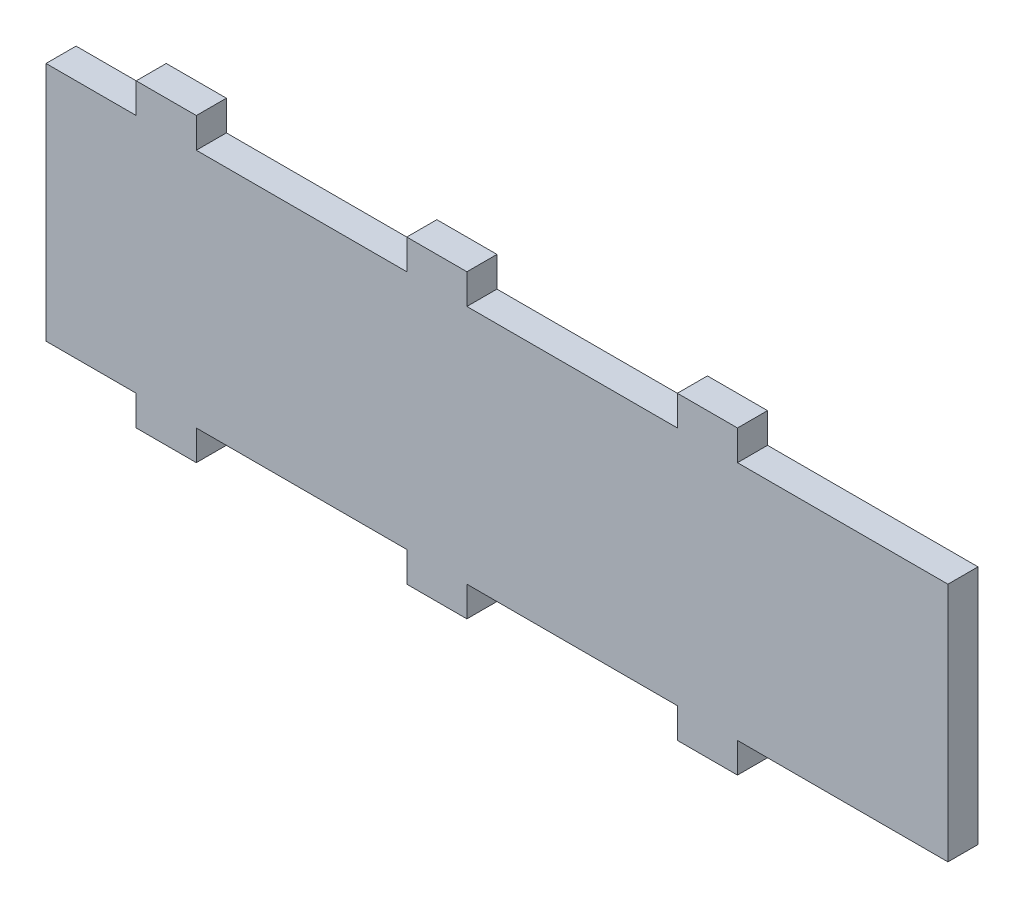
ISO-10303-21;
HEADER;
FILE_DESCRIPTION(('STEP AP214'),'2;1');
FILE_NAME('part.step','',(''),(''),'','','');
FILE_SCHEMA(('AUTOMOTIVE_DESIGN { 1 0 10303 214 1 1 1 1 }'));
ENDSEC;
DATA;
#1=APPLICATION_CONTEXT('core data for automotive mechanical design processes');
#2=APPLICATION_PROTOCOL_DEFINITION('international standard','automotive_design',2000,#1);
#3=PRODUCT_CONTEXT('',#1,'mechanical');
#4=PRODUCT('Part','Part','',(#3));
#5=PRODUCT_RELATED_PRODUCT_CATEGORY('part','',(#4));
#6=PRODUCT_DEFINITION_FORMATION('','',#4);
#7=PRODUCT_DEFINITION_CONTEXT('part definition',#1,'design');
#8=PRODUCT_DEFINITION('design','',#6,#7);
#9=PRODUCT_DEFINITION_SHAPE('','',#8);
#10=(LENGTH_UNIT() NAMED_UNIT(*) SI_UNIT(.MILLI.,.METRE.));
#11=(NAMED_UNIT(*) PLANE_ANGLE_UNIT() SI_UNIT($,.RADIAN.));
#12=(NAMED_UNIT(*) SI_UNIT($,.STERADIAN.) SOLID_ANGLE_UNIT());
#13=UNCERTAINTY_MEASURE_WITH_UNIT(LENGTH_MEASURE(1.E-05),#10,'distance_accuracy_value','');
#14=(GEOMETRIC_REPRESENTATION_CONTEXT(3) GLOBAL_UNCERTAINTY_ASSIGNED_CONTEXT((#13)) GLOBAL_UNIT_ASSIGNED_CONTEXT((#10,
#11,#12)) REPRESENTATION_CONTEXT('',''));
#15=CARTESIAN_POINT('',(0.,0.,0.));
#16=DIRECTION('',(0.,0.,1.));
#17=DIRECTION('',(1.,0.,0.));
#18=AXIS2_PLACEMENT_3D('',#15,#16,#17);
#19=CARTESIAN_POINT('',(0.,0.,5.));
#20=DIRECTION('',(1.,0.,0.));
#21=DIRECTION('',(0.,0.,-1.));
#22=AXIS2_PLACEMENT_3D('',#19,#20,#21);
#23=PLANE('',#22);
#24=DIRECTION('',(0.,-1.,0.));
#25=VECTOR('',#24,1.);
#26=CARTESIAN_POINT('',(0.,0.,0.));
#27=LINE('',#26,#25);
#28=CARTESIAN_POINT('',(0.,40.,0.));
#29=VERTEX_POINT('',#28);
#30=CARTESIAN_POINT('',(0.,0.,0.));
#31=VERTEX_POINT('',#30);
#32=EDGE_CURVE('E249',#29,#31,#27,.T.);
#33=ORIENTED_EDGE('',*,*,#32,.T.);
#34=DIRECTION('',(0.,0.,-1.));
#35=VECTOR('',#34,1.);
#36=CARTESIAN_POINT('',(0.,0.,5.));
#37=LINE('',#36,#35);
#38=CARTESIAN_POINT('',(0.,0.,5.));
#39=VERTEX_POINT('',#38);
#40=EDGE_CURVE('E11',#39,#31,#37,.T.);
#41=ORIENTED_EDGE('',*,*,#40,.F.);
#42=DIRECTION('',(0.,-1.,0.));
#43=VECTOR('',#42,1.);
#44=CARTESIAN_POINT('',(0.,0.,5.));
#45=LINE('',#44,#43);
#46=CARTESIAN_POINT('',(0.,40.,5.));
#47=VERTEX_POINT('',#46);
#48=EDGE_CURVE('E303',#47,#39,#45,.T.);
#49=ORIENTED_EDGE('',*,*,#48,.F.);
#50=DIRECTION('',(0.,0.,-1.));
#51=VECTOR('',#50,1.);
#52=CARTESIAN_POINT('',(0.,40.,5.));
#53=LINE('',#52,#51);
#54=EDGE_CURVE('E245',#47,#29,#53,.T.);
#55=ORIENTED_EDGE('',*,*,#54,.T.);
#56=EDGE_LOOP('',(#33,#41,#49,#55));
#57=FACE_BOUND('',#56,.T.);
#58=ADVANCED_FACE('F33',(#57),#23,.F.);
#59=CARTESIAN_POINT('',(0.,0.,5.));
#60=DIRECTION('',(0.,1.,0.));
#61=DIRECTION('',(0.,0.,1.));
#62=AXIS2_PLACEMENT_3D('',#59,#60,#61);
#63=PLANE('',#62);
#64=DIRECTION('',(1.,0.,0.));
#65=VECTOR('',#64,1.);
#66=CARTESIAN_POINT('',(0.,0.,0.));
#67=LINE('',#66,#65);
#68=CARTESIAN_POINT('',(15.,0.,0.));
#69=VERTEX_POINT('',#68);
#70=EDGE_CURVE('E252',#31,#69,#67,.T.);
#71=ORIENTED_EDGE('',*,*,#70,.T.);
#72=DIRECTION('',(0.,0.,-1.));
#73=VECTOR('',#72,1.);
#74=CARTESIAN_POINT('',(15.,0.,5.));
#75=LINE('',#74,#73);
#76=CARTESIAN_POINT('',(15.,0.,5.));
#77=VERTEX_POINT('',#76);
#78=EDGE_CURVE('E41',#77,#69,#75,.T.);
#79=ORIENTED_EDGE('',*,*,#78,.F.);
#80=DIRECTION('',(1.,0.,0.));
#81=VECTOR('',#80,1.);
#82=CARTESIAN_POINT('',(0.,0.,5.));
#83=LINE('',#82,#81);
#84=EDGE_CURVE('E152',#39,#77,#83,.T.);
#85=ORIENTED_EDGE('',*,*,#84,.F.);
#86=ORIENTED_EDGE('',*,*,#40,.T.);
#87=EDGE_LOOP('',(#71,#79,#85,#86));
#88=FACE_BOUND('',#87,.T.);
#89=ADVANCED_FACE('F461',(#88),#63,.F.);
#90=CARTESIAN_POINT('',(15.,0.,5.));
#91=DIRECTION('',(1.,0.,0.));
#92=DIRECTION('',(0.,0.,-1.));
#93=AXIS2_PLACEMENT_3D('',#90,#91,#92);
#94=PLANE('',#93);
#95=DIRECTION('',(0.,-1.,0.));
#96=VECTOR('',#95,1.);
#97=CARTESIAN_POINT('',(15.,0.,0.));
#98=LINE('',#97,#96);
#99=CARTESIAN_POINT('',(15.,-5.,0.));
#100=VERTEX_POINT('',#99);
#101=EDGE_CURVE('E254',#69,#100,#98,.T.);
#102=ORIENTED_EDGE('',*,*,#101,.T.);
#103=DIRECTION('',(0.,0.,-1.));
#104=VECTOR('',#103,1.);
#105=CARTESIAN_POINT('',(15.,-5.,5.));
#106=LINE('',#105,#104);
#107=CARTESIAN_POINT('',(15.,-5.,5.));
#108=VERTEX_POINT('',#107);
#109=EDGE_CURVE('E370',#108,#100,#106,.T.);
#110=ORIENTED_EDGE('',*,*,#109,.F.);
#111=DIRECTION('',(0.,-1.,0.));
#112=VECTOR('',#111,1.);
#113=CARTESIAN_POINT('',(15.,0.,5.));
#114=LINE('',#113,#112);
#115=EDGE_CURVE('E378',#77,#108,#114,.T.);
#116=ORIENTED_EDGE('',*,*,#115,.F.);
#117=ORIENTED_EDGE('',*,*,#78,.T.);
#118=EDGE_LOOP('',(#102,#110,#116,#117));
#119=FACE_BOUND('',#118,.T.);
#120=ADVANCED_FACE('F376',(#119),#94,.F.);
#121=CARTESIAN_POINT('',(15.,-5.,5.));
#122=DIRECTION('',(0.,1.,0.));
#123=DIRECTION('',(0.,0.,1.));
#124=AXIS2_PLACEMENT_3D('',#121,#122,#123);
#125=PLANE('',#124);
#126=DIRECTION('',(1.,0.,0.));
#127=VECTOR('',#126,1.);
#128=CARTESIAN_POINT('',(15.,-5.,0.));
#129=LINE('',#128,#127);
#130=CARTESIAN_POINT('',(25.,-5.,0.));
#131=VERTEX_POINT('',#130);
#132=EDGE_CURVE('E256',#100,#131,#129,.T.);
#133=ORIENTED_EDGE('',*,*,#132,.T.);
#134=DIRECTION('',(0.,0.,-1.));
#135=VECTOR('',#134,1.);
#136=CARTESIAN_POINT('',(25.,-5.,5.));
#137=LINE('',#136,#135);
#138=CARTESIAN_POINT('',(25.,-5.,5.));
#139=VERTEX_POINT('',#138);
#140=EDGE_CURVE('E367',#139,#131,#137,.T.);
#141=ORIENTED_EDGE('',*,*,#140,.F.);
#142=DIRECTION('',(1.,0.,0.));
#143=VECTOR('',#142,1.);
#144=CARTESIAN_POINT('',(15.,-5.,5.));
#145=LINE('',#144,#143);
#146=EDGE_CURVE('E396',#108,#139,#145,.T.);
#147=ORIENTED_EDGE('',*,*,#146,.F.);
#148=ORIENTED_EDGE('',*,*,#109,.T.);
#149=EDGE_LOOP('',(#133,#141,#147,#148));
#150=FACE_BOUND('',#149,.T.);
#151=ADVANCED_FACE('F387',(#150),#125,.F.);
#152=CARTESIAN_POINT('',(25.,0.,5.));
#153=DIRECTION('',(-1.,0.,0.));
#154=DIRECTION('',(0.,0.,1.));
#155=AXIS2_PLACEMENT_3D('',#152,#153,#154);
#156=PLANE('',#155);
#157=DIRECTION('',(0.,1.,0.));
#158=VECTOR('',#157,1.);
#159=CARTESIAN_POINT('',(25.,0.,0.));
#160=LINE('',#159,#158);
#161=CARTESIAN_POINT('',(25.,0.,0.));
#162=VERTEX_POINT('',#161);
#163=EDGE_CURVE('E258',#131,#162,#160,.T.);
#164=ORIENTED_EDGE('',*,*,#163,.T.);
#165=DIRECTION('',(0.,0.,-1.));
#166=VECTOR('',#165,1.);
#167=CARTESIAN_POINT('',(25.,0.,5.));
#168=LINE('',#167,#166);
#169=CARTESIAN_POINT('',(25.,0.,5.));
#170=VERTEX_POINT('',#169);
#171=EDGE_CURVE('E364',#170,#162,#168,.T.);
#172=ORIENTED_EDGE('',*,*,#171,.F.);
#173=DIRECTION('',(0.,1.,0.));
#174=VECTOR('',#173,1.);
#175=CARTESIAN_POINT('',(25.,0.,5.));
#176=LINE('',#175,#174);
#177=EDGE_CURVE('E393',#139,#170,#176,.T.);
#178=ORIENTED_EDGE('',*,*,#177,.F.);
#179=ORIENTED_EDGE('',*,*,#140,.T.);
#180=EDGE_LOOP('',(#164,#172,#178,#179));
#181=FACE_BOUND('',#180,.T.);
#182=ADVANCED_FACE('F391',(#181),#156,.F.);
#183=CARTESIAN_POINT('',(25.,0.,5.));
#184=DIRECTION('',(0.,1.,0.));
#185=DIRECTION('',(0.,0.,1.));
#186=AXIS2_PLACEMENT_3D('',#183,#184,#185);
#187=PLANE('',#186);
#188=DIRECTION('',(1.,0.,0.));
#189=VECTOR('',#188,1.);
#190=CARTESIAN_POINT('',(25.,0.,0.));
#191=LINE('',#190,#189);
#192=CARTESIAN_POINT('',(60.,0.,0.));
#193=VERTEX_POINT('',#192);
#194=EDGE_CURVE('E260',#162,#193,#191,.T.);
#195=ORIENTED_EDGE('',*,*,#194,.T.);
#196=DIRECTION('',(0.,0.,-1.));
#197=VECTOR('',#196,1.);
#198=CARTESIAN_POINT('',(60.,0.,5.));
#199=LINE('',#198,#197);
#200=CARTESIAN_POINT('',(60.,0.,5.));
#201=VERTEX_POINT('',#200);
#202=EDGE_CURVE('E361',#201,#193,#199,.T.);
#203=ORIENTED_EDGE('',*,*,#202,.F.);
#204=DIRECTION('',(1.,0.,0.));
#205=VECTOR('',#204,1.);
#206=CARTESIAN_POINT('',(25.,0.,5.));
#207=LINE('',#206,#205);
#208=EDGE_CURVE('E395',#170,#201,#207,.T.);
#209=ORIENTED_EDGE('',*,*,#208,.F.);
#210=ORIENTED_EDGE('',*,*,#171,.T.);
#211=EDGE_LOOP('',(#195,#203,#209,#210));
#212=FACE_BOUND('',#211,.T.);
#213=ADVANCED_FACE('F474',(#212),#187,.F.);
#214=CARTESIAN_POINT('',(60.,0.,5.));
#215=DIRECTION('',(1.,0.,0.));
#216=DIRECTION('',(0.,0.,-1.));
#217=AXIS2_PLACEMENT_3D('',#214,#215,#216);
#218=PLANE('',#217);
#219=DIRECTION('',(0.,-1.,0.));
#220=VECTOR('',#219,1.);
#221=CARTESIAN_POINT('',(60.,0.,0.));
#222=LINE('',#221,#220);
#223=CARTESIAN_POINT('',(60.,-5.,0.));
#224=VERTEX_POINT('',#223);
#225=EDGE_CURVE('E262',#193,#224,#222,.T.);
#226=ORIENTED_EDGE('',*,*,#225,.T.);
#227=DIRECTION('',(0.,0.,-1.));
#228=VECTOR('',#227,1.);
#229=CARTESIAN_POINT('',(60.,-5.,5.));
#230=LINE('',#229,#228);
#231=CARTESIAN_POINT('',(60.,-5.,5.));
#232=VERTEX_POINT('',#231);
#233=EDGE_CURVE('E358',#232,#224,#230,.T.);
#234=ORIENTED_EDGE('',*,*,#233,.F.);
#235=DIRECTION('',(0.,-1.,0.));
#236=VECTOR('',#235,1.);
#237=CARTESIAN_POINT('',(60.,0.,5.));
#238=LINE('',#237,#236);
#239=EDGE_CURVE('E398',#201,#232,#238,.T.);
#240=ORIENTED_EDGE('',*,*,#239,.F.);
#241=ORIENTED_EDGE('',*,*,#202,.T.);
#242=EDGE_LOOP('',(#226,#234,#240,#241));
#243=FACE_BOUND('',#242,.T.);
#244=ADVANCED_FACE('F477',(#243),#218,.F.);
#245=CARTESIAN_POINT('',(60.,-5.,5.));
#246=DIRECTION('',(0.,1.,0.));
#247=DIRECTION('',(0.,0.,1.));
#248=AXIS2_PLACEMENT_3D('',#245,#246,#247);
#249=PLANE('',#248);
#250=DIRECTION('',(1.,0.,0.));
#251=VECTOR('',#250,1.);
#252=CARTESIAN_POINT('',(60.,-5.,0.));
#253=LINE('',#252,#251);
#254=CARTESIAN_POINT('',(70.,-5.,0.));
#255=VERTEX_POINT('',#254);
#256=EDGE_CURVE('E264',#224,#255,#253,.T.);
#257=ORIENTED_EDGE('',*,*,#256,.T.);
#258=DIRECTION('',(0.,0.,-1.));
#259=VECTOR('',#258,1.);
#260=CARTESIAN_POINT('',(70.,-5.,5.));
#261=LINE('',#260,#259);
#262=CARTESIAN_POINT('',(70.,-5.,5.));
#263=VERTEX_POINT('',#262);
#264=EDGE_CURVE('E355',#263,#255,#261,.T.);
#265=ORIENTED_EDGE('',*,*,#264,.F.);
#266=DIRECTION('',(1.,0.,0.));
#267=VECTOR('',#266,1.);
#268=CARTESIAN_POINT('',(60.,-5.,5.));
#269=LINE('',#268,#267);
#270=EDGE_CURVE('E404',#232,#263,#269,.T.);
#271=ORIENTED_EDGE('',*,*,#270,.F.);
#272=ORIENTED_EDGE('',*,*,#233,.T.);
#273=EDGE_LOOP('',(#257,#265,#271,#272));
#274=FACE_BOUND('',#273,.T.);
#275=ADVANCED_FACE('F481',(#274),#249,.F.);
#276=CARTESIAN_POINT('',(70.,0.,5.));
#277=DIRECTION('',(-1.,0.,0.));
#278=DIRECTION('',(0.,0.,1.));
#279=AXIS2_PLACEMENT_3D('',#276,#277,#278);
#280=PLANE('',#279);
#281=DIRECTION('',(0.,1.,0.));
#282=VECTOR('',#281,1.);
#283=CARTESIAN_POINT('',(70.,0.,0.));
#284=LINE('',#283,#282);
#285=CARTESIAN_POINT('',(70.,0.,0.));
#286=VERTEX_POINT('',#285);
#287=EDGE_CURVE('E266',#255,#286,#284,.T.);
#288=ORIENTED_EDGE('',*,*,#287,.T.);
#289=DIRECTION('',(0.,0.,-1.));
#290=VECTOR('',#289,1.);
#291=CARTESIAN_POINT('',(70.,0.,5.));
#292=LINE('',#291,#290);
#293=CARTESIAN_POINT('',(70.,0.,5.));
#294=VERTEX_POINT('',#293);
#295=EDGE_CURVE('E352',#294,#286,#292,.T.);
#296=ORIENTED_EDGE('',*,*,#295,.F.);
#297=DIRECTION('',(0.,1.,0.));
#298=VECTOR('',#297,1.);
#299=CARTESIAN_POINT('',(70.,0.,5.));
#300=LINE('',#299,#298);
#301=EDGE_CURVE('E406',#263,#294,#300,.T.);
#302=ORIENTED_EDGE('',*,*,#301,.F.);
#303=ORIENTED_EDGE('',*,*,#264,.T.);
#304=EDGE_LOOP('',(#288,#296,#302,#303));
#305=FACE_BOUND('',#304,.T.);
#306=ADVANCED_FACE('F485',(#305),#280,.F.);
#307=CARTESIAN_POINT('',(70.,0.,5.));
#308=DIRECTION('',(0.,1.,0.));
#309=DIRECTION('',(0.,0.,1.));
#310=AXIS2_PLACEMENT_3D('',#307,#308,#309);
#311=PLANE('',#310);
#312=DIRECTION('',(1.,0.,0.));
#313=VECTOR('',#312,1.);
#314=CARTESIAN_POINT('',(70.,0.,0.));
#315=LINE('',#314,#313);
#316=CARTESIAN_POINT('',(105.,0.,0.));
#317=VERTEX_POINT('',#316);
#318=EDGE_CURVE('E268',#286,#317,#315,.T.);
#319=ORIENTED_EDGE('',*,*,#318,.T.);
#320=DIRECTION('',(0.,0.,-1.));
#321=VECTOR('',#320,1.);
#322=CARTESIAN_POINT('',(105.,0.,5.));
#323=LINE('',#322,#321);
#324=CARTESIAN_POINT('',(105.,0.,5.));
#325=VERTEX_POINT('',#324);
#326=EDGE_CURVE('E349',#325,#317,#323,.T.);
#327=ORIENTED_EDGE('',*,*,#326,.F.);
#328=DIRECTION('',(1.,0.,0.));
#329=VECTOR('',#328,1.);
#330=CARTESIAN_POINT('',(70.,0.,5.));
#331=LINE('',#330,#329);
#332=EDGE_CURVE('E408',#294,#325,#331,.T.);
#333=ORIENTED_EDGE('',*,*,#332,.F.);
#334=ORIENTED_EDGE('',*,*,#295,.T.);
#335=EDGE_LOOP('',(#319,#327,#333,#334));
#336=FACE_BOUND('',#335,.T.);
#337=ADVANCED_FACE('F489',(#336),#311,.F.);
#338=CARTESIAN_POINT('',(105.,0.,5.));
#339=DIRECTION('',(1.,0.,0.));
#340=DIRECTION('',(0.,0.,-1.));
#341=AXIS2_PLACEMENT_3D('',#338,#339,#340);
#342=PLANE('',#341);
#343=DIRECTION('',(0.,-1.,0.));
#344=VECTOR('',#343,1.);
#345=CARTESIAN_POINT('',(105.,0.,0.));
#346=LINE('',#345,#344);
#347=CARTESIAN_POINT('',(105.,-5.,0.));
#348=VERTEX_POINT('',#347);
#349=EDGE_CURVE('E270',#317,#348,#346,.T.);
#350=ORIENTED_EDGE('',*,*,#349,.T.);
#351=DIRECTION('',(0.,0.,-1.));
#352=VECTOR('',#351,1.);
#353=CARTESIAN_POINT('',(105.,-5.,5.));
#354=LINE('',#353,#352);
#355=CARTESIAN_POINT('',(105.,-5.,5.));
#356=VERTEX_POINT('',#355);
#357=EDGE_CURVE('E346',#356,#348,#354,.T.);
#358=ORIENTED_EDGE('',*,*,#357,.F.);
#359=DIRECTION('',(0.,-1.,0.));
#360=VECTOR('',#359,1.);
#361=CARTESIAN_POINT('',(105.,0.,5.));
#362=LINE('',#361,#360);
#363=EDGE_CURVE('E410',#325,#356,#362,.T.);
#364=ORIENTED_EDGE('',*,*,#363,.F.);
#365=ORIENTED_EDGE('',*,*,#326,.T.);
#366=EDGE_LOOP('',(#350,#358,#364,#365));
#367=FACE_BOUND('',#366,.T.);
#368=ADVANCED_FACE('F493',(#367),#342,.F.);
#369=CARTESIAN_POINT('',(105.,-5.,5.));
#370=DIRECTION('',(0.,1.,0.));
#371=DIRECTION('',(0.,0.,1.));
#372=AXIS2_PLACEMENT_3D('',#369,#370,#371);
#373=PLANE('',#372);
#374=DIRECTION('',(1.,0.,0.));
#375=VECTOR('',#374,1.);
#376=CARTESIAN_POINT('',(105.,-5.,0.));
#377=LINE('',#376,#375);
#378=CARTESIAN_POINT('',(115.,-5.,0.));
#379=VERTEX_POINT('',#378);
#380=EDGE_CURVE('E272',#348,#379,#377,.T.);
#381=ORIENTED_EDGE('',*,*,#380,.T.);
#382=DIRECTION('',(0.,0.,-1.));
#383=VECTOR('',#382,1.);
#384=CARTESIAN_POINT('',(115.,-5.,5.));
#385=LINE('',#384,#383);
#386=CARTESIAN_POINT('',(115.,-5.,5.));
#387=VERTEX_POINT('',#386);
#388=EDGE_CURVE('E343',#387,#379,#385,.T.);
#389=ORIENTED_EDGE('',*,*,#388,.F.);
#390=DIRECTION('',(1.,0.,0.));
#391=VECTOR('',#390,1.);
#392=CARTESIAN_POINT('',(105.,-5.,5.));
#393=LINE('',#392,#391);
#394=EDGE_CURVE('E412',#356,#387,#393,.T.);
#395=ORIENTED_EDGE('',*,*,#394,.F.);
#396=ORIENTED_EDGE('',*,*,#357,.T.);
#397=EDGE_LOOP('',(#381,#389,#395,#396));
#398=FACE_BOUND('',#397,.T.);
#399=ADVANCED_FACE('F497',(#398),#373,.F.);
#400=CARTESIAN_POINT('',(115.,0.,5.));
#401=DIRECTION('',(-1.,0.,0.));
#402=DIRECTION('',(0.,0.,1.));
#403=AXIS2_PLACEMENT_3D('',#400,#401,#402);
#404=PLANE('',#403);
#405=DIRECTION('',(0.,1.,0.));
#406=VECTOR('',#405,1.);
#407=CARTESIAN_POINT('',(115.,0.,0.));
#408=LINE('',#407,#406);
#409=CARTESIAN_POINT('',(115.,0.,0.));
#410=VERTEX_POINT('',#409);
#411=EDGE_CURVE('E274',#379,#410,#408,.T.);
#412=ORIENTED_EDGE('',*,*,#411,.T.);
#413=DIRECTION('',(0.,0.,-1.));
#414=VECTOR('',#413,1.);
#415=CARTESIAN_POINT('',(115.,0.,5.));
#416=LINE('',#415,#414);
#417=CARTESIAN_POINT('',(115.,0.,5.));
#418=VERTEX_POINT('',#417);
#419=EDGE_CURVE('E340',#418,#410,#416,.T.);
#420=ORIENTED_EDGE('',*,*,#419,.F.);
#421=DIRECTION('',(0.,1.,0.));
#422=VECTOR('',#421,1.);
#423=CARTESIAN_POINT('',(115.,0.,5.));
#424=LINE('',#423,#422);
#425=EDGE_CURVE('E414',#387,#418,#424,.T.);
#426=ORIENTED_EDGE('',*,*,#425,.F.);
#427=ORIENTED_EDGE('',*,*,#388,.T.);
#428=EDGE_LOOP('',(#412,#420,#426,#427));
#429=FACE_BOUND('',#428,.T.);
#430=ADVANCED_FACE('F501',(#429),#404,.F.);
#431=CARTESIAN_POINT('',(115.,0.,5.));
#432=DIRECTION('',(0.,1.,0.));
#433=DIRECTION('',(0.,0.,1.));
#434=AXIS2_PLACEMENT_3D('',#431,#432,#433);
#435=PLANE('',#434);
#436=DIRECTION('',(1.,0.,0.));
#437=VECTOR('',#436,1.);
#438=CARTESIAN_POINT('',(115.,0.,0.));
#439=LINE('',#438,#437);
#440=CARTESIAN_POINT('',(150.,0.,0.));
#441=VERTEX_POINT('',#440);
#442=EDGE_CURVE('E276',#410,#441,#439,.T.);
#443=ORIENTED_EDGE('',*,*,#442,.T.);
#444=DIRECTION('',(0.,0.,-1.));
#445=VECTOR('',#444,1.);
#446=CARTESIAN_POINT('',(150.,0.,5.));
#447=LINE('',#446,#445);
#448=CARTESIAN_POINT('',(150.,0.,5.));
#449=VERTEX_POINT('',#448);
#450=EDGE_CURVE('E337',#449,#441,#447,.T.);
#451=ORIENTED_EDGE('',*,*,#450,.F.);
#452=DIRECTION('',(1.,0.,0.));
#453=VECTOR('',#452,1.);
#454=CARTESIAN_POINT('',(115.,0.,5.));
#455=LINE('',#454,#453);
#456=EDGE_CURVE('E416',#418,#449,#455,.T.);
#457=ORIENTED_EDGE('',*,*,#456,.F.);
#458=ORIENTED_EDGE('',*,*,#419,.T.);
#459=EDGE_LOOP('',(#443,#451,#457,#458));
#460=FACE_BOUND('',#459,.T.);
#461=ADVANCED_FACE('F505',(#460),#435,.F.);
#462=CARTESIAN_POINT('',(150.,0.,5.));
#463=DIRECTION('',(-1.,0.,0.));
#464=DIRECTION('',(0.,0.,1.));
#465=AXIS2_PLACEMENT_3D('',#462,#463,#464);
#466=PLANE('',#465);
#467=DIRECTION('',(0.,1.,0.));
#468=VECTOR('',#467,1.);
#469=CARTESIAN_POINT('',(150.,0.,0.));
#470=LINE('',#469,#468);
#471=CARTESIAN_POINT('',(150.,40.,0.));
#472=VERTEX_POINT('',#471);
#473=EDGE_CURVE('E278',#441,#472,#470,.T.);
#474=ORIENTED_EDGE('',*,*,#473,.T.);
#475=DIRECTION('',(0.,0.,-1.));
#476=VECTOR('',#475,1.);
#477=CARTESIAN_POINT('',(150.,40.,5.));
#478=LINE('',#477,#476);
#479=CARTESIAN_POINT('',(150.,40.,5.));
#480=VERTEX_POINT('',#479);
#481=EDGE_CURVE('E334',#480,#472,#478,.T.);
#482=ORIENTED_EDGE('',*,*,#481,.F.);
#483=DIRECTION('',(0.,1.,0.));
#484=VECTOR('',#483,1.);
#485=CARTESIAN_POINT('',(150.,0.,5.));
#486=LINE('',#485,#484);
#487=EDGE_CURVE('E418',#449,#480,#486,.T.);
#488=ORIENTED_EDGE('',*,*,#487,.F.);
#489=ORIENTED_EDGE('',*,*,#450,.T.);
#490=EDGE_LOOP('',(#474,#482,#488,#489));
#491=FACE_BOUND('',#490,.T.);
#492=ADVANCED_FACE('F509',(#491),#466,.F.);
#493=CARTESIAN_POINT('',(115.,40.,5.));
#494=DIRECTION('',(0.,-1.,0.));
#495=DIRECTION('',(0.,0.,-1.));
#496=AXIS2_PLACEMENT_3D('',#493,#494,#495);
#497=PLANE('',#496);
#498=DIRECTION('',(-1.,0.,0.));
#499=VECTOR('',#498,1.);
#500=CARTESIAN_POINT('',(115.,40.,0.));
#501=LINE('',#500,#499);
#502=CARTESIAN_POINT('',(115.,40.,0.));
#503=VERTEX_POINT('',#502);
#504=EDGE_CURVE('E280',#472,#503,#501,.T.);
#505=ORIENTED_EDGE('',*,*,#504,.T.);
#506=DIRECTION('',(0.,0.,-1.));
#507=VECTOR('',#506,1.);
#508=CARTESIAN_POINT('',(115.,40.,5.));
#509=LINE('',#508,#507);
#510=CARTESIAN_POINT('',(115.,40.,5.));
#511=VERTEX_POINT('',#510);
#512=EDGE_CURVE('E331',#511,#503,#509,.T.);
#513=ORIENTED_EDGE('',*,*,#512,.F.);
#514=DIRECTION('',(-1.,0.,0.));
#515=VECTOR('',#514,1.);
#516=CARTESIAN_POINT('',(115.,40.,5.));
#517=LINE('',#516,#515);
#518=EDGE_CURVE('E420',#480,#511,#517,.T.);
#519=ORIENTED_EDGE('',*,*,#518,.F.);
#520=ORIENTED_EDGE('',*,*,#481,.T.);
#521=EDGE_LOOP('',(#505,#513,#519,#520));
#522=FACE_BOUND('',#521,.T.);
#523=ADVANCED_FACE('F513',(#522),#497,.F.);
#524=CARTESIAN_POINT('',(115.,40.,5.));
#525=DIRECTION('',(-1.,0.,0.));
#526=DIRECTION('',(0.,0.,1.));
#527=AXIS2_PLACEMENT_3D('',#524,#525,#526);
#528=PLANE('',#527);
#529=DIRECTION('',(0.,1.,0.));
#530=VECTOR('',#529,1.);
#531=CARTESIAN_POINT('',(115.,40.,0.));
#532=LINE('',#531,#530);
#533=CARTESIAN_POINT('',(115.,45.,0.));
#534=VERTEX_POINT('',#533);
#535=EDGE_CURVE('E282',#503,#534,#532,.T.);
#536=ORIENTED_EDGE('',*,*,#535,.T.);
#537=DIRECTION('',(0.,0.,-1.));
#538=VECTOR('',#537,1.);
#539=CARTESIAN_POINT('',(115.,45.,5.));
#540=LINE('',#539,#538);
#541=CARTESIAN_POINT('',(115.,45.,5.));
#542=VERTEX_POINT('',#541);
#543=EDGE_CURVE('E328',#542,#534,#540,.T.);
#544=ORIENTED_EDGE('',*,*,#543,.F.);
#545=DIRECTION('',(0.,1.,0.));
#546=VECTOR('',#545,1.);
#547=CARTESIAN_POINT('',(115.,40.,5.));
#548=LINE('',#547,#546);
#549=EDGE_CURVE('E422',#511,#542,#548,.T.);
#550=ORIENTED_EDGE('',*,*,#549,.F.);
#551=ORIENTED_EDGE('',*,*,#512,.T.);
#552=EDGE_LOOP('',(#536,#544,#550,#551));
#553=FACE_BOUND('',#552,.T.);
#554=ADVANCED_FACE('F517',(#553),#528,.F.);
#555=CARTESIAN_POINT('',(105.,45.,5.));
#556=DIRECTION('',(0.,-1.,0.));
#557=DIRECTION('',(0.,0.,-1.));
#558=AXIS2_PLACEMENT_3D('',#555,#556,#557);
#559=PLANE('',#558);
#560=DIRECTION('',(-1.,0.,0.));
#561=VECTOR('',#560,1.);
#562=CARTESIAN_POINT('',(105.,45.,0.));
#563=LINE('',#562,#561);
#564=CARTESIAN_POINT('',(105.,45.,0.));
#565=VERTEX_POINT('',#564);
#566=EDGE_CURVE('E284',#534,#565,#563,.T.);
#567=ORIENTED_EDGE('',*,*,#566,.T.);
#568=DIRECTION('',(0.,0.,-1.));
#569=VECTOR('',#568,1.);
#570=CARTESIAN_POINT('',(105.,45.,5.));
#571=LINE('',#570,#569);
#572=CARTESIAN_POINT('',(105.,45.,5.));
#573=VERTEX_POINT('',#572);
#574=EDGE_CURVE('E325',#573,#565,#571,.T.);
#575=ORIENTED_EDGE('',*,*,#574,.F.);
#576=DIRECTION('',(-1.,0.,0.));
#577=VECTOR('',#576,1.);
#578=CARTESIAN_POINT('',(105.,45.,5.));
#579=LINE('',#578,#577);
#580=EDGE_CURVE('E424',#542,#573,#579,.T.);
#581=ORIENTED_EDGE('',*,*,#580,.F.);
#582=ORIENTED_EDGE('',*,*,#543,.T.);
#583=EDGE_LOOP('',(#567,#575,#581,#582));
#584=FACE_BOUND('',#583,.T.);
#585=ADVANCED_FACE('F521',(#584),#559,.F.);
#586=CARTESIAN_POINT('',(105.,40.,5.));
#587=DIRECTION('',(1.,0.,0.));
#588=DIRECTION('',(0.,0.,-1.));
#589=AXIS2_PLACEMENT_3D('',#586,#587,#588);
#590=PLANE('',#589);
#591=DIRECTION('',(0.,-1.,0.));
#592=VECTOR('',#591,1.);
#593=CARTESIAN_POINT('',(105.,40.,0.));
#594=LINE('',#593,#592);
#595=CARTESIAN_POINT('',(105.,40.,0.));
#596=VERTEX_POINT('',#595);
#597=EDGE_CURVE('E286',#565,#596,#594,.T.);
#598=ORIENTED_EDGE('',*,*,#597,.T.);
#599=DIRECTION('',(0.,0.,-1.));
#600=VECTOR('',#599,1.);
#601=CARTESIAN_POINT('',(105.,40.,5.));
#602=LINE('',#601,#600);
#603=CARTESIAN_POINT('',(105.,40.,5.));
#604=VERTEX_POINT('',#603);
#605=EDGE_CURVE('E322',#604,#596,#602,.T.);
#606=ORIENTED_EDGE('',*,*,#605,.F.);
#607=DIRECTION('',(0.,-1.,0.));
#608=VECTOR('',#607,1.);
#609=CARTESIAN_POINT('',(105.,40.,5.));
#610=LINE('',#609,#608);
#611=EDGE_CURVE('E426',#573,#604,#610,.T.);
#612=ORIENTED_EDGE('',*,*,#611,.F.);
#613=ORIENTED_EDGE('',*,*,#574,.T.);
#614=EDGE_LOOP('',(#598,#606,#612,#613));
#615=FACE_BOUND('',#614,.T.);
#616=ADVANCED_FACE('F525',(#615),#590,.F.);
#617=CARTESIAN_POINT('',(70.,40.,5.));
#618=DIRECTION('',(0.,-1.,0.));
#619=DIRECTION('',(0.,0.,-1.));
#620=AXIS2_PLACEMENT_3D('',#617,#618,#619);
#621=PLANE('',#620);
#622=DIRECTION('',(-1.,0.,0.));
#623=VECTOR('',#622,1.);
#624=CARTESIAN_POINT('',(70.,40.,0.));
#625=LINE('',#624,#623);
#626=CARTESIAN_POINT('',(70.,40.,0.));
#627=VERTEX_POINT('',#626);
#628=EDGE_CURVE('E288',#596,#627,#625,.T.);
#629=ORIENTED_EDGE('',*,*,#628,.T.);
#630=DIRECTION('',(0.,0.,-1.));
#631=VECTOR('',#630,1.);
#632=CARTESIAN_POINT('',(70.,40.,5.));
#633=LINE('',#632,#631);
#634=CARTESIAN_POINT('',(70.,40.,5.));
#635=VERTEX_POINT('',#634);
#636=EDGE_CURVE('E319',#635,#627,#633,.T.);
#637=ORIENTED_EDGE('',*,*,#636,.F.);
#638=DIRECTION('',(-1.,0.,0.));
#639=VECTOR('',#638,1.);
#640=CARTESIAN_POINT('',(70.,40.,5.));
#641=LINE('',#640,#639);
#642=EDGE_CURVE('E428',#604,#635,#641,.T.);
#643=ORIENTED_EDGE('',*,*,#642,.F.);
#644=ORIENTED_EDGE('',*,*,#605,.T.);
#645=EDGE_LOOP('',(#629,#637,#643,#644));
#646=FACE_BOUND('',#645,.T.);
#647=ADVANCED_FACE('F529',(#646),#621,.F.);
#648=CARTESIAN_POINT('',(70.,40.,5.));
#649=DIRECTION('',(-1.,0.,0.));
#650=DIRECTION('',(0.,0.,1.));
#651=AXIS2_PLACEMENT_3D('',#648,#649,#650);
#652=PLANE('',#651);
#653=DIRECTION('',(0.,1.,0.));
#654=VECTOR('',#653,1.);
#655=CARTESIAN_POINT('',(70.,40.,0.));
#656=LINE('',#655,#654);
#657=CARTESIAN_POINT('',(70.,45.,0.));
#658=VERTEX_POINT('',#657);
#659=EDGE_CURVE('E290',#627,#658,#656,.T.);
#660=ORIENTED_EDGE('',*,*,#659,.T.);
#661=DIRECTION('',(0.,0.,-1.));
#662=VECTOR('',#661,1.);
#663=CARTESIAN_POINT('',(70.,45.,5.));
#664=LINE('',#663,#662);
#665=CARTESIAN_POINT('',(70.,45.,5.));
#666=VERTEX_POINT('',#665);
#667=EDGE_CURVE('E316',#666,#658,#664,.T.);
#668=ORIENTED_EDGE('',*,*,#667,.F.);
#669=DIRECTION('',(0.,1.,0.));
#670=VECTOR('',#669,1.);
#671=CARTESIAN_POINT('',(70.,40.,5.));
#672=LINE('',#671,#670);
#673=EDGE_CURVE('E430',#635,#666,#672,.T.);
#674=ORIENTED_EDGE('',*,*,#673,.F.);
#675=ORIENTED_EDGE('',*,*,#636,.T.);
#676=EDGE_LOOP('',(#660,#668,#674,#675));
#677=FACE_BOUND('',#676,.T.);
#678=ADVANCED_FACE('F533',(#677),#652,.F.);
#679=CARTESIAN_POINT('',(60.,45.,5.));
#680=DIRECTION('',(0.,-1.,0.));
#681=DIRECTION('',(0.,0.,-1.));
#682=AXIS2_PLACEMENT_3D('',#679,#680,#681);
#683=PLANE('',#682);
#684=DIRECTION('',(-1.,0.,0.));
#685=VECTOR('',#684,1.);
#686=CARTESIAN_POINT('',(60.,45.,0.));
#687=LINE('',#686,#685);
#688=CARTESIAN_POINT('',(60.,45.,0.));
#689=VERTEX_POINT('',#688);
#690=EDGE_CURVE('E292',#658,#689,#687,.T.);
#691=ORIENTED_EDGE('',*,*,#690,.T.);
#692=DIRECTION('',(0.,0.,-1.));
#693=VECTOR('',#692,1.);
#694=CARTESIAN_POINT('',(60.,45.,5.));
#695=LINE('',#694,#693);
#696=CARTESIAN_POINT('',(60.,45.,5.));
#697=VERTEX_POINT('',#696);
#698=EDGE_CURVE('E313',#697,#689,#695,.T.);
#699=ORIENTED_EDGE('',*,*,#698,.F.);
#700=DIRECTION('',(-1.,0.,0.));
#701=VECTOR('',#700,1.);
#702=CARTESIAN_POINT('',(60.,45.,5.));
#703=LINE('',#702,#701);
#704=EDGE_CURVE('E432',#666,#697,#703,.T.);
#705=ORIENTED_EDGE('',*,*,#704,.F.);
#706=ORIENTED_EDGE('',*,*,#667,.T.);
#707=EDGE_LOOP('',(#691,#699,#705,#706));
#708=FACE_BOUND('',#707,.T.);
#709=ADVANCED_FACE('F537',(#708),#683,.F.);
#710=CARTESIAN_POINT('',(60.,40.,5.));
#711=DIRECTION('',(1.,0.,0.));
#712=DIRECTION('',(0.,0.,-1.));
#713=AXIS2_PLACEMENT_3D('',#710,#711,#712);
#714=PLANE('',#713);
#715=DIRECTION('',(0.,-1.,0.));
#716=VECTOR('',#715,1.);
#717=CARTESIAN_POINT('',(60.,40.,0.));
#718=LINE('',#717,#716);
#719=CARTESIAN_POINT('',(60.,40.,0.));
#720=VERTEX_POINT('',#719);
#721=EDGE_CURVE('E294',#689,#720,#718,.T.);
#722=ORIENTED_EDGE('',*,*,#721,.T.);
#723=DIRECTION('',(0.,0.,-1.));
#724=VECTOR('',#723,1.);
#725=CARTESIAN_POINT('',(60.,40.,5.));
#726=LINE('',#725,#724);
#727=CARTESIAN_POINT('',(60.,40.,5.));
#728=VERTEX_POINT('',#727);
#729=EDGE_CURVE('E310',#728,#720,#726,.T.);
#730=ORIENTED_EDGE('',*,*,#729,.F.);
#731=DIRECTION('',(0.,-1.,0.));
#732=VECTOR('',#731,1.);
#733=CARTESIAN_POINT('',(60.,40.,5.));
#734=LINE('',#733,#732);
#735=EDGE_CURVE('E434',#697,#728,#734,.T.);
#736=ORIENTED_EDGE('',*,*,#735,.F.);
#737=ORIENTED_EDGE('',*,*,#698,.T.);
#738=EDGE_LOOP('',(#722,#730,#736,#737));
#739=FACE_BOUND('',#738,.T.);
#740=ADVANCED_FACE('F541',(#739),#714,.F.);
#741=CARTESIAN_POINT('',(25.,40.,5.));
#742=DIRECTION('',(0.,-1.,0.));
#743=DIRECTION('',(0.,0.,-1.));
#744=AXIS2_PLACEMENT_3D('',#741,#742,#743);
#745=PLANE('',#744);
#746=DIRECTION('',(-1.,0.,0.));
#747=VECTOR('',#746,1.);
#748=CARTESIAN_POINT('',(25.,40.,0.));
#749=LINE('',#748,#747);
#750=CARTESIAN_POINT('',(25.,40.,0.));
#751=VERTEX_POINT('',#750);
#752=EDGE_CURVE('E296',#720,#751,#749,.T.);
#753=ORIENTED_EDGE('',*,*,#752,.T.);
#754=DIRECTION('',(0.,0.,-1.));
#755=VECTOR('',#754,1.);
#756=CARTESIAN_POINT('',(25.,40.,5.));
#757=LINE('',#756,#755);
#758=CARTESIAN_POINT('',(25.,40.,5.));
#759=VERTEX_POINT('',#758);
#760=EDGE_CURVE('E307',#759,#751,#757,.T.);
#761=ORIENTED_EDGE('',*,*,#760,.F.);
#762=DIRECTION('',(-1.,0.,0.));
#763=VECTOR('',#762,1.);
#764=CARTESIAN_POINT('',(25.,40.,5.));
#765=LINE('',#764,#763);
#766=EDGE_CURVE('E436',#728,#759,#765,.T.);
#767=ORIENTED_EDGE('',*,*,#766,.F.);
#768=ORIENTED_EDGE('',*,*,#729,.T.);
#769=EDGE_LOOP('',(#753,#761,#767,#768));
#770=FACE_BOUND('',#769,.T.);
#771=ADVANCED_FACE('F442',(#770),#745,.F.);
#772=CARTESIAN_POINT('',(25.,40.,5.));
#773=DIRECTION('',(-1.,0.,0.));
#774=DIRECTION('',(0.,0.,1.));
#775=AXIS2_PLACEMENT_3D('',#772,#773,#774);
#776=PLANE('',#775);
#777=DIRECTION('',(0.,1.,0.));
#778=VECTOR('',#777,1.);
#779=CARTESIAN_POINT('',(25.,40.,0.));
#780=LINE('',#779,#778);
#781=CARTESIAN_POINT('',(25.,45.,0.));
#782=VERTEX_POINT('',#781);
#783=EDGE_CURVE('E298',#751,#782,#780,.T.);
#784=ORIENTED_EDGE('',*,*,#783,.T.);
#785=DIRECTION('',(0.,0.,-1.));
#786=VECTOR('',#785,1.);
#787=CARTESIAN_POINT('',(25.,45.,5.));
#788=LINE('',#787,#786);
#789=CARTESIAN_POINT('',(25.,45.,5.));
#790=VERTEX_POINT('',#789);
#791=EDGE_CURVE('E240',#790,#782,#788,.T.);
#792=ORIENTED_EDGE('',*,*,#791,.F.);
#793=DIRECTION('',(0.,1.,0.));
#794=VECTOR('',#793,1.);
#795=CARTESIAN_POINT('',(25.,40.,5.));
#796=LINE('',#795,#794);
#797=EDGE_CURVE('E231',#759,#790,#796,.T.);
#798=ORIENTED_EDGE('',*,*,#797,.F.);
#799=ORIENTED_EDGE('',*,*,#760,.T.);
#800=EDGE_LOOP('',(#784,#792,#798,#799));
#801=FACE_BOUND('',#800,.T.);
#802=ADVANCED_FACE('F446',(#801),#776,.F.);
#803=CARTESIAN_POINT('',(15.,45.,5.));
#804=DIRECTION('',(0.,-1.,0.));
#805=DIRECTION('',(0.,0.,-1.));
#806=AXIS2_PLACEMENT_3D('',#803,#804,#805);
#807=PLANE('',#806);
#808=DIRECTION('',(-1.,0.,0.));
#809=VECTOR('',#808,1.);
#810=CARTESIAN_POINT('',(15.,45.,0.));
#811=LINE('',#810,#809);
#812=CARTESIAN_POINT('',(15.,45.,0.));
#813=VERTEX_POINT('',#812);
#814=EDGE_CURVE('E239',#782,#813,#811,.T.);
#815=ORIENTED_EDGE('',*,*,#814,.T.);
#816=DIRECTION('',(0.,0.,-1.));
#817=VECTOR('',#816,1.);
#818=CARTESIAN_POINT('',(15.,45.,5.));
#819=LINE('',#818,#817);
#820=CARTESIAN_POINT('',(15.,45.,5.));
#821=VERTEX_POINT('',#820);
#822=EDGE_CURVE('E236',#821,#813,#819,.T.);
#823=ORIENTED_EDGE('',*,*,#822,.F.);
#824=DIRECTION('',(-1.,0.,0.));
#825=VECTOR('',#824,1.);
#826=CARTESIAN_POINT('',(15.,45.,5.));
#827=LINE('',#826,#825);
#828=EDGE_CURVE('E225',#790,#821,#827,.T.);
#829=ORIENTED_EDGE('',*,*,#828,.F.);
#830=ORIENTED_EDGE('',*,*,#791,.T.);
#831=EDGE_LOOP('',(#815,#823,#829,#830));
#832=FACE_BOUND('',#831,.T.);
#833=ADVANCED_FACE('F237',(#832),#807,.F.);
#834=CARTESIAN_POINT('',(15.,40.,5.));
#835=DIRECTION('',(1.,0.,0.));
#836=DIRECTION('',(0.,0.,-1.));
#837=AXIS2_PLACEMENT_3D('',#834,#835,#836);
#838=PLANE('',#837);
#839=DIRECTION('',(0.,-1.,0.));
#840=VECTOR('',#839,1.);
#841=CARTESIAN_POINT('',(15.,40.,0.));
#842=LINE('',#841,#840);
#843=CARTESIAN_POINT('',(15.,40.,0.));
#844=VERTEX_POINT('',#843);
#845=EDGE_CURVE('E138',#813,#844,#842,.T.);
#846=ORIENTED_EDGE('',*,*,#845,.T.);
#847=DIRECTION('',(0.,0.,-1.));
#848=VECTOR('',#847,1.);
#849=CARTESIAN_POINT('',(15.,40.,5.));
#850=LINE('',#849,#848);
#851=CARTESIAN_POINT('',(15.,40.,5.));
#852=VERTEX_POINT('',#851);
#853=EDGE_CURVE('E241',#852,#844,#850,.T.);
#854=ORIENTED_EDGE('',*,*,#853,.F.);
#855=DIRECTION('',(0.,-1.,0.));
#856=VECTOR('',#855,1.);
#857=CARTESIAN_POINT('',(15.,40.,5.));
#858=LINE('',#857,#856);
#859=EDGE_CURVE('E229',#821,#852,#858,.T.);
#860=ORIENTED_EDGE('',*,*,#859,.F.);
#861=ORIENTED_EDGE('',*,*,#822,.T.);
#862=EDGE_LOOP('',(#846,#854,#860,#861));
#863=FACE_BOUND('',#862,.T.);
#864=ADVANCED_FACE('F243',(#863),#838,.F.);
#865=CARTESIAN_POINT('',(0.,40.,5.));
#866=DIRECTION('',(0.,-1.,0.));
#867=DIRECTION('',(0.,0.,-1.));
#868=AXIS2_PLACEMENT_3D('',#865,#866,#867);
#869=PLANE('',#868);
#870=DIRECTION('',(-1.,0.,0.));
#871=VECTOR('',#870,1.);
#872=CARTESIAN_POINT('',(0.,40.,0.));
#873=LINE('',#872,#871);
#874=EDGE_CURVE('E144',#844,#29,#873,.T.);
#875=ORIENTED_EDGE('',*,*,#874,.T.);
#876=ORIENTED_EDGE('',*,*,#54,.F.);
#877=DIRECTION('',(-1.,0.,0.));
#878=VECTOR('',#877,1.);
#879=CARTESIAN_POINT('',(0.,40.,5.));
#880=LINE('',#879,#878);
#881=EDGE_CURVE('E49',#852,#47,#880,.T.);
#882=ORIENTED_EDGE('',*,*,#881,.F.);
#883=ORIENTED_EDGE('',*,*,#853,.T.);
#884=EDGE_LOOP('',(#875,#876,#882,#883));
#885=FACE_BOUND('',#884,.T.);
#886=ADVANCED_FACE('F450',(#885),#869,.F.);
#887=CARTESIAN_POINT('',(0.,0.,5.));
#888=DIRECTION('',(0.,0.,-1.));
#889=DIRECTION('',(-1.,0.,0.));
#890=AXIS2_PLACEMENT_3D('',#887,#888,#889);
#891=PLANE('',#890);
#892=ORIENTED_EDGE('',*,*,#48,.T.);
#893=ORIENTED_EDGE('',*,*,#84,.T.);
#894=ORIENTED_EDGE('',*,*,#115,.T.);
#895=ORIENTED_EDGE('',*,*,#146,.T.);
#896=ORIENTED_EDGE('',*,*,#177,.T.);
#897=ORIENTED_EDGE('',*,*,#208,.T.);
#898=ORIENTED_EDGE('',*,*,#239,.T.);
#899=ORIENTED_EDGE('',*,*,#270,.T.);
#900=ORIENTED_EDGE('',*,*,#301,.T.);
#901=ORIENTED_EDGE('',*,*,#332,.T.);
#902=ORIENTED_EDGE('',*,*,#363,.T.);
#903=ORIENTED_EDGE('',*,*,#394,.T.);
#904=ORIENTED_EDGE('',*,*,#425,.T.);
#905=ORIENTED_EDGE('',*,*,#456,.T.);
#906=ORIENTED_EDGE('',*,*,#487,.T.);
#907=ORIENTED_EDGE('',*,*,#518,.T.);
#908=ORIENTED_EDGE('',*,*,#549,.T.);
#909=ORIENTED_EDGE('',*,*,#580,.T.);
#910=ORIENTED_EDGE('',*,*,#611,.T.);
#911=ORIENTED_EDGE('',*,*,#642,.T.);
#912=ORIENTED_EDGE('',*,*,#673,.T.);
#913=ORIENTED_EDGE('',*,*,#704,.T.);
#914=ORIENTED_EDGE('',*,*,#735,.T.);
#915=ORIENTED_EDGE('',*,*,#766,.T.);
#916=ORIENTED_EDGE('',*,*,#797,.T.);
#917=ORIENTED_EDGE('',*,*,#828,.T.);
#918=ORIENTED_EDGE('',*,*,#859,.T.);
#919=ORIENTED_EDGE('',*,*,#881,.T.);
#920=EDGE_LOOP('',(#892,#893,#894,#895,#896,#897,#898,#899,#900,#901,#902,#903,#904,#905,#906,
#907,#908,#909,#910,#911,#912,#913,#914,#915,#916,#917,#918,#919));
#921=FACE_BOUND('',#920,.T.);
#922=ADVANCED_FACE('F227',(#921),#891,.F.);
#923=CARTESIAN_POINT('',(0.,0.,0.));
#924=DIRECTION('',(0.,0.,-1.));
#925=DIRECTION('',(-1.,0.,0.));
#926=AXIS2_PLACEMENT_3D('',#923,#924,#925);
#927=PLANE('',#926);
#928=ORIENTED_EDGE('',*,*,#32,.F.);
#929=ORIENTED_EDGE('',*,*,#874,.F.);
#930=ORIENTED_EDGE('',*,*,#845,.F.);
#931=ORIENTED_EDGE('',*,*,#814,.F.);
#932=ORIENTED_EDGE('',*,*,#783,.F.);
#933=ORIENTED_EDGE('',*,*,#752,.F.);
#934=ORIENTED_EDGE('',*,*,#721,.F.);
#935=ORIENTED_EDGE('',*,*,#690,.F.);
#936=ORIENTED_EDGE('',*,*,#659,.F.);
#937=ORIENTED_EDGE('',*,*,#628,.F.);
#938=ORIENTED_EDGE('',*,*,#597,.F.);
#939=ORIENTED_EDGE('',*,*,#566,.F.);
#940=ORIENTED_EDGE('',*,*,#535,.F.);
#941=ORIENTED_EDGE('',*,*,#504,.F.);
#942=ORIENTED_EDGE('',*,*,#473,.F.);
#943=ORIENTED_EDGE('',*,*,#442,.F.);
#944=ORIENTED_EDGE('',*,*,#411,.F.);
#945=ORIENTED_EDGE('',*,*,#380,.F.);
#946=ORIENTED_EDGE('',*,*,#349,.F.);
#947=ORIENTED_EDGE('',*,*,#318,.F.);
#948=ORIENTED_EDGE('',*,*,#287,.F.);
#949=ORIENTED_EDGE('',*,*,#256,.F.);
#950=ORIENTED_EDGE('',*,*,#225,.F.);
#951=ORIENTED_EDGE('',*,*,#194,.F.);
#952=ORIENTED_EDGE('',*,*,#163,.F.);
#953=ORIENTED_EDGE('',*,*,#132,.F.);
#954=ORIENTED_EDGE('',*,*,#101,.F.);
#955=ORIENTED_EDGE('',*,*,#70,.F.);
#956=EDGE_LOOP('',(#928,#929,#930,#931,#932,#933,#934,#935,#936,#937,#938,#939,#940,#941,#942,
#943,#944,#945,#946,#947,#948,#949,#950,#951,#952,#953,#954,#955));
#957=FACE_BOUND('',#956,.T.);
#958=ADVANCED_FACE('F382',(#957),#927,.T.);
#959=CLOSED_SHELL('',(#58,#89,#120,#151,#182,#213,#244,#275,#306,#337,#368,#399,#430,#461,#492,
#523,#554,#585,#616,#647,#678,#709,#740,#771,#802,#833,#864,#886,#922,#958));
#960=MANIFOLD_SOLID_BREP('B2',#959);
#961=ADVANCED_BREP_SHAPE_REPRESENTATION('',(#18,#960),#14);
#962=SHAPE_DEFINITION_REPRESENTATION(#9,#961);
ENDSEC;
END-ISO-10303-21;
